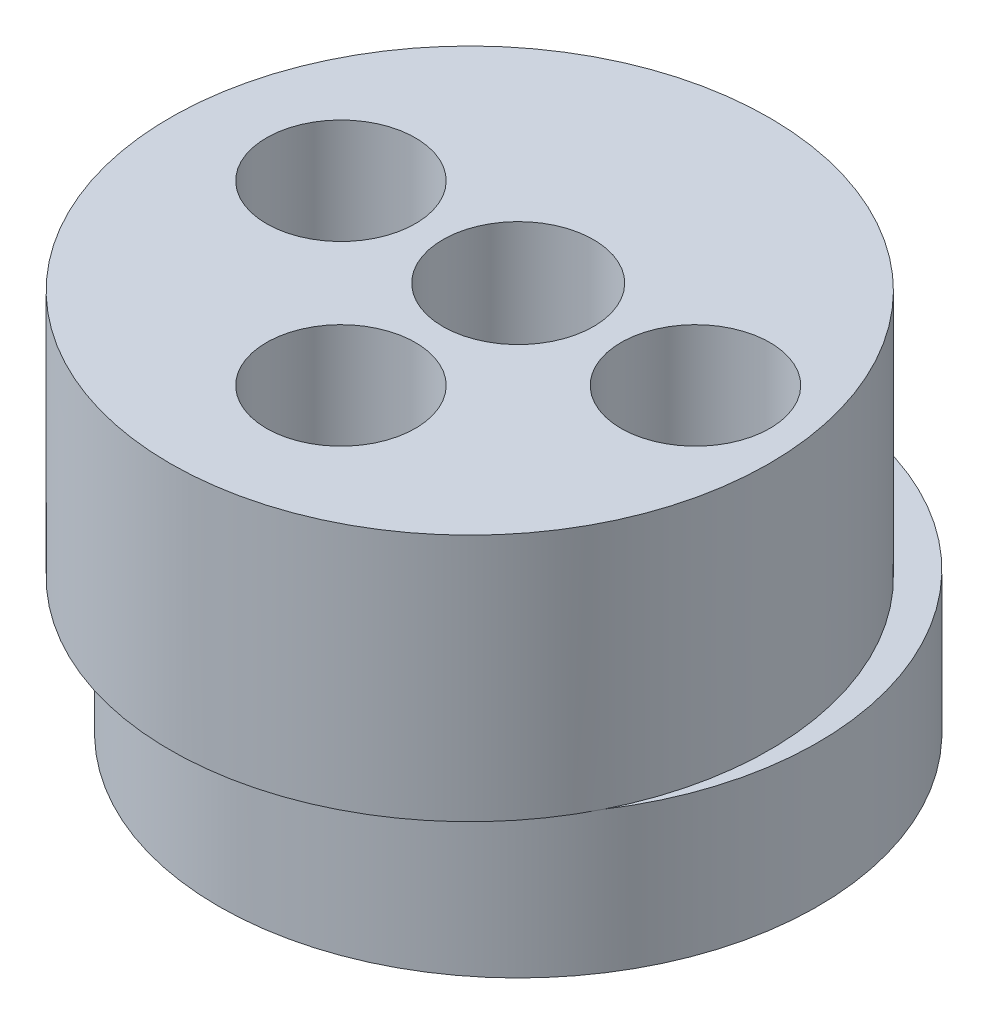
ISO-10303-21;
HEADER;
FILE_DESCRIPTION(('STEP AP214'),'2;1');
FILE_NAME('part.step','',(''),(''),'','','');
FILE_SCHEMA(('AUTOMOTIVE_DESIGN { 1 0 10303 214 1 1 1 1 }'));
ENDSEC;
DATA;
#1=APPLICATION_CONTEXT('core data for automotive mechanical design processes');
#2=APPLICATION_PROTOCOL_DEFINITION('international standard','automotive_design',2000,#1);
#3=PRODUCT_CONTEXT('',#1,'mechanical');
#4=PRODUCT('Part','Part','',(#3));
#5=PRODUCT_RELATED_PRODUCT_CATEGORY('part','',(#4));
#6=PRODUCT_DEFINITION_FORMATION('','',#4);
#7=PRODUCT_DEFINITION_CONTEXT('part definition',#1,'design');
#8=PRODUCT_DEFINITION('design','',#6,#7);
#9=PRODUCT_DEFINITION_SHAPE('','',#8);
#10=(LENGTH_UNIT() NAMED_UNIT(*) SI_UNIT(.MILLI.,.METRE.));
#11=(NAMED_UNIT(*) PLANE_ANGLE_UNIT() SI_UNIT($,.RADIAN.));
#12=(NAMED_UNIT(*) SI_UNIT($,.STERADIAN.) SOLID_ANGLE_UNIT());
#13=UNCERTAINTY_MEASURE_WITH_UNIT(LENGTH_MEASURE(1.E-05),#10,'distance_accuracy_value','');
#14=(GEOMETRIC_REPRESENTATION_CONTEXT(3) GLOBAL_UNCERTAINTY_ASSIGNED_CONTEXT((#13)) GLOBAL_UNIT_ASSIGNED_CONTEXT((#10,
#11,#12)) REPRESENTATION_CONTEXT('',''));
#15=CARTESIAN_POINT('',(0.,0.,0.));
#16=DIRECTION('',(0.,0.,1.));
#17=DIRECTION('',(1.,0.,0.));
#18=AXIS2_PLACEMENT_3D('',#15,#16,#17);
#19=CARTESIAN_POINT('',(0.,26.,5.));
#20=DIRECTION('',(0.,-1.,0.));
#21=DIRECTION('',(0.,0.,-1.));
#22=AXIS2_PLACEMENT_3D('',#19,#20,#21);
#23=CYLINDRICAL_SURFACE('',#22,2.1);
#24=CARTESIAN_POINT('',(0.,7.,5.));
#25=DIRECTION('',(0.,1.,0.));
#26=DIRECTION('',(0.,0.,1.));
#27=AXIS2_PLACEMENT_3D('',#24,#25,#26);
#28=CIRCLE('',#27,2.1);
#29=CARTESIAN_POINT('',(0.,7.,7.1));
#30=VERTEX_POINT('',#29);
#31=EDGE_CURVE('E11',#30,#30,#28,.T.);
#32=ORIENTED_EDGE('',*,*,#31,.F.);
#33=EDGE_LOOP('',(#32));
#34=FACE_BOUND('',#33,.T.);
#35=CARTESIAN_POINT('',(0.,18.,5.));
#36=DIRECTION('',(0.,1.,0.));
#37=DIRECTION('',(0.,0.,1.));
#38=AXIS2_PLACEMENT_3D('',#35,#36,#37);
#39=CIRCLE('',#38,2.1);
#40=CARTESIAN_POINT('',(0.,18.,7.1));
#41=VERTEX_POINT('',#40);
#42=EDGE_CURVE('E83',#41,#41,#39,.T.);
#43=ORIENTED_EDGE('',*,*,#42,.T.);
#44=EDGE_LOOP('',(#43));
#45=FACE_BOUND('',#44,.T.);
#46=ADVANCED_FACE('F47',(#34,#45),#23,.F.);
#47=CARTESIAN_POINT('',(-5.,26.,0.));
#48=DIRECTION('',(0.,-1.,0.));
#49=DIRECTION('',(0.,0.,-1.));
#50=AXIS2_PLACEMENT_3D('',#47,#48,#49);
#51=CYLINDRICAL_SURFACE('',#50,2.1);
#52=CARTESIAN_POINT('',(-5.,7.,0.));
#53=DIRECTION('',(0.,1.,0.));
#54=DIRECTION('',(0.,0.,1.));
#55=AXIS2_PLACEMENT_3D('',#52,#53,#54);
#56=CIRCLE('',#55,2.1);
#57=CARTESIAN_POINT('',(-5.,7.,2.1));
#58=VERTEX_POINT('',#57);
#59=EDGE_CURVE('E57',#58,#58,#56,.T.);
#60=ORIENTED_EDGE('',*,*,#59,.F.);
#61=EDGE_LOOP('',(#60));
#62=FACE_BOUND('',#61,.T.);
#63=CARTESIAN_POINT('',(-5.,18.,0.));
#64=DIRECTION('',(0.,1.,0.));
#65=DIRECTION('',(0.,0.,1.));
#66=AXIS2_PLACEMENT_3D('',#63,#64,#65);
#67=CIRCLE('',#66,2.1);
#68=CARTESIAN_POINT('',(-5.,18.,2.1));
#69=VERTEX_POINT('',#68);
#70=EDGE_CURVE('E103',#69,#69,#67,.T.);
#71=ORIENTED_EDGE('',*,*,#70,.T.);
#72=EDGE_LOOP('',(#71));
#73=FACE_BOUND('',#72,.T.);
#74=ADVANCED_FACE('F137',(#62,#73),#51,.F.);
#75=CARTESIAN_POINT('',(5.,26.,0.));
#76=DIRECTION('',(0.,-1.,0.));
#77=DIRECTION('',(0.,0.,-1.));
#78=AXIS2_PLACEMENT_3D('',#75,#76,#77);
#79=CYLINDRICAL_SURFACE('',#78,2.1);
#80=CARTESIAN_POINT('',(5.,7.,0.));
#81=DIRECTION('',(0.,1.,0.));
#82=DIRECTION('',(0.,0.,1.));
#83=AXIS2_PLACEMENT_3D('',#80,#81,#82);
#84=CIRCLE('',#83,2.1);
#85=CARTESIAN_POINT('',(5.,7.,2.1));
#86=VERTEX_POINT('',#85);
#87=EDGE_CURVE('E107',#86,#86,#84,.T.);
#88=ORIENTED_EDGE('',*,*,#87,.F.);
#89=EDGE_LOOP('',(#88));
#90=FACE_BOUND('',#89,.T.);
#91=CARTESIAN_POINT('',(5.,18.,0.));
#92=DIRECTION('',(0.,1.,0.));
#93=DIRECTION('',(0.,0.,1.));
#94=AXIS2_PLACEMENT_3D('',#91,#92,#93);
#95=CIRCLE('',#94,2.1);
#96=CARTESIAN_POINT('',(5.,18.,2.1));
#97=VERTEX_POINT('',#96);
#98=EDGE_CURVE('E114',#97,#97,#95,.T.);
#99=ORIENTED_EDGE('',*,*,#98,.T.);
#100=EDGE_LOOP('',(#99));
#101=FACE_BOUND('',#100,.T.);
#102=ADVANCED_FACE('F121',(#90,#101),#79,.F.);
#103=CARTESIAN_POINT('',(0.,30.75,0.));
#104=DIRECTION('',(0.,-1.,0.));
#105=DIRECTION('',(0.,0.,-1.));
#106=AXIS2_PLACEMENT_3D('',#103,#104,#105);
#107=CYLINDRICAL_SURFACE('',#106,2.125);
#108=CARTESIAN_POINT('',(0.,7.,0.));
#109=DIRECTION('',(0.,1.,0.));
#110=DIRECTION('',(0.,0.,1.));
#111=AXIS2_PLACEMENT_3D('',#108,#109,#110);
#112=CIRCLE('',#111,2.125);
#113=CARTESIAN_POINT('',(0.,7.,2.125));
#114=VERTEX_POINT('',#113);
#115=EDGE_CURVE('E111',#114,#114,#112,.F.);
#116=ORIENTED_EDGE('',*,*,#115,.T.);
#117=EDGE_LOOP('',(#116));
#118=FACE_BOUND('',#117,.T.);
#119=CARTESIAN_POINT('',(0.,18.,0.));
#120=DIRECTION('',(0.,1.,0.));
#121=DIRECTION('',(0.,0.,1.));
#122=AXIS2_PLACEMENT_3D('',#119,#120,#121);
#123=CIRCLE('',#122,2.125);
#124=CARTESIAN_POINT('',(0.,18.,2.125));
#125=VERTEX_POINT('',#124);
#126=EDGE_CURVE('E51',#125,#125,#123,.F.);
#127=ORIENTED_EDGE('',*,*,#126,.F.);
#128=EDGE_LOOP('',(#127));
#129=FACE_BOUND('',#128,.T.);
#130=ADVANCED_FACE('F155',(#118,#129),#107,.F.);
#131=CARTESIAN_POINT('',(-0.500000000000004,11.,0.866025403784436));
#132=DIRECTION('',(0.,1.,0.));
#133=DIRECTION('',(0.,0.,1.));
#134=AXIS2_PLACEMENT_3D('',#131,#132,#133);
#135=PLANE('',#134);
#136=CARTESIAN_POINT('',(-0.500000000000004,11.,0.866025403784436));
#137=DIRECTION('',(0.,1.,0.));
#138=DIRECTION('',(0.,0.,1.));
#139=AXIS2_PLACEMENT_3D('',#136,#137,#138);
#140=CIRCLE('',#139,8.45);
#141=CARTESIAN_POINT('',(-7.55509240187965,11.,-3.78458436278813));
#142=VERTEX_POINT('',#141);
#143=CARTESIAN_POINT('',(7.05509240187964,11.,4.65060976657257));
#144=VERTEX_POINT('',#143);
#145=EDGE_CURVE('E78',#142,#144,#140,.T.);
#146=ORIENTED_EDGE('',*,*,#145,.F.);
#147=CARTESIAN_POINT('',(0.,11.,0.));
#148=DIRECTION('',(0.,1.,0.));
#149=DIRECTION('',(0.,0.,1.));
#150=AXIS2_PLACEMENT_3D('',#147,#148,#149);
#151=CIRCLE('',#150,8.45);
#152=EDGE_CURVE('E75',#142,#144,#151,.T.);
#153=ORIENTED_EDGE('',*,*,#152,.T.);
#154=EDGE_LOOP('',(#146,#153));
#155=FACE_BOUND('',#154,.T.);
#156=ADVANCED_FACE('F81',(#155),#135,.F.);
#157=CARTESIAN_POINT('',(0.249999999999999,11.,0.433012701892218));
#158=DIRECTION('',(0.,1.,0.));
#159=DIRECTION('',(0.,0.,1.));
#160=AXIS2_PLACEMENT_3D('',#157,#158,#159);
#161=PLANE('',#160);
#162=CARTESIAN_POINT('',(0.,11.,0.));
#163=DIRECTION('',(0.,1.,0.));
#164=DIRECTION('',(0.,0.,1.));
#165=AXIS2_PLACEMENT_3D('',#162,#163,#164);
#166=CIRCLE('',#165,8.45);
#167=EDGE_CURVE('E64',#144,#142,#166,.T.);
#168=ORIENTED_EDGE('',*,*,#167,.T.);
#169=CARTESIAN_POINT('',(-0.500000000000004,11.,0.866025403784436));
#170=DIRECTION('',(0.,1.,0.));
#171=DIRECTION('',(0.,0.,1.));
#172=AXIS2_PLACEMENT_3D('',#169,#170,#171);
#173=CIRCLE('',#172,8.45);
#174=EDGE_CURVE('E66',#144,#142,#173,.T.);
#175=ORIENTED_EDGE('',*,*,#174,.F.);
#176=EDGE_LOOP('',(#168,#175));
#177=FACE_BOUND('',#176,.T.);
#178=ADVANCED_FACE('F67',(#177),#161,.T.);
#179=CARTESIAN_POINT('',(-0.500000000000004,18.,0.866025403784436));
#180=DIRECTION('',(0.,-1.,0.));
#181=DIRECTION('',(0.,0.,-1.));
#182=AXIS2_PLACEMENT_3D('',#179,#180,#181);
#183=CYLINDRICAL_SURFACE('',#182,8.45);
#184=ORIENTED_EDGE('',*,*,#174,.T.);
#185=ORIENTED_EDGE('',*,*,#145,.T.);
#186=EDGE_LOOP('',(#184,#185));
#187=FACE_BOUND('',#186,.T.);
#188=CARTESIAN_POINT('',(-0.500000000000004,18.,0.866025403784436));
#189=DIRECTION('',(0.,1.,0.));
#190=DIRECTION('',(0.,0.,1.));
#191=AXIS2_PLACEMENT_3D('',#188,#189,#190);
#192=CIRCLE('',#191,8.45);
#193=CARTESIAN_POINT('',(-0.500000000000004,18.,9.31602540378443));
#194=VERTEX_POINT('',#193);
#195=EDGE_CURVE('E89',#194,#194,#192,.T.);
#196=ORIENTED_EDGE('',*,*,#195,.F.);
#197=EDGE_LOOP('',(#196));
#198=FACE_BOUND('',#197,.T.);
#199=ADVANCED_FACE('F86',(#187,#198),#183,.T.);
#200=CARTESIAN_POINT('',(0.,29.,0.));
#201=DIRECTION('',(0.,-1.,0.));
#202=DIRECTION('',(0.,0.,-1.));
#203=AXIS2_PLACEMENT_3D('',#200,#201,#202);
#204=CYLINDRICAL_SURFACE('',#203,8.45);
#205=CARTESIAN_POINT('',(0.,7.,0.));
#206=DIRECTION('',(0.,1.,0.));
#207=DIRECTION('',(0.,0.,1.));
#208=AXIS2_PLACEMENT_3D('',#205,#206,#207);
#209=CIRCLE('',#208,8.45);
#210=CARTESIAN_POINT('',(0.,7.,8.45));
#211=VERTEX_POINT('',#210);
#212=EDGE_CURVE('E84',#211,#211,#209,.T.);
#213=ORIENTED_EDGE('',*,*,#212,.T.);
#214=EDGE_LOOP('',(#213));
#215=FACE_BOUND('',#214,.T.);
#216=ORIENTED_EDGE('',*,*,#167,.F.);
#217=ORIENTED_EDGE('',*,*,#152,.F.);
#218=EDGE_LOOP('',(#216,#217));
#219=FACE_BOUND('',#218,.T.);
#220=ADVANCED_FACE('F49',(#215,#219),#204,.T.);
#221=CARTESIAN_POINT('',(-0.500000000000004,18.,0.866025403784436));
#222=DIRECTION('',(0.,1.,0.));
#223=DIRECTION('',(0.,0.,1.));
#224=AXIS2_PLACEMENT_3D('',#221,#222,#223);
#225=PLANE('',#224);
#226=ORIENTED_EDGE('',*,*,#195,.T.);
#227=EDGE_LOOP('',(#226));
#228=FACE_BOUND('',#227,.T.);
#229=ORIENTED_EDGE('',*,*,#98,.F.);
#230=EDGE_LOOP('',(#229));
#231=FACE_BOUND('',#230,.T.);
#232=ORIENTED_EDGE('',*,*,#126,.T.);
#233=EDGE_LOOP('',(#232));
#234=FACE_BOUND('',#233,.T.);
#235=ORIENTED_EDGE('',*,*,#70,.F.);
#236=EDGE_LOOP('',(#235));
#237=FACE_BOUND('',#236,.T.);
#238=ORIENTED_EDGE('',*,*,#42,.F.);
#239=EDGE_LOOP('',(#238));
#240=FACE_BOUND('',#239,.T.);
#241=ADVANCED_FACE('F123',(#228,#231,#234,#237,#240),#225,.T.);
#242=CARTESIAN_POINT('',(0.5,7.,0.));
#243=DIRECTION('',(0.,1.,0.));
#244=DIRECTION('',(0.,0.,1.));
#245=AXIS2_PLACEMENT_3D('',#242,#243,#244);
#246=PLANE('',#245);
#247=ORIENTED_EDGE('',*,*,#212,.F.);
#248=EDGE_LOOP('',(#247));
#249=FACE_BOUND('',#248,.T.);
#250=ORIENTED_EDGE('',*,*,#31,.T.);
#251=EDGE_LOOP('',(#250));
#252=FACE_BOUND('',#251,.T.);
#253=ORIENTED_EDGE('',*,*,#59,.T.);
#254=EDGE_LOOP('',(#253));
#255=FACE_BOUND('',#254,.T.);
#256=ORIENTED_EDGE('',*,*,#87,.T.);
#257=EDGE_LOOP('',(#256));
#258=FACE_BOUND('',#257,.T.);
#259=ORIENTED_EDGE('',*,*,#115,.F.);
#260=EDGE_LOOP('',(#259));
#261=FACE_BOUND('',#260,.T.);
#262=ADVANCED_FACE('F126',(#249,#252,#255,#258,#261),#246,.F.);
#263=CLOSED_SHELL('',(#46,#74,#102,#130,#156,#178,#199,#220,#241,#262));
#264=MANIFOLD_SOLID_BREP('B2',#263);
#265=ADVANCED_BREP_SHAPE_REPRESENTATION('',(#18,#264),#14);
#266=SHAPE_DEFINITION_REPRESENTATION(#9,#265);
ENDSEC;
END-ISO-10303-21;
